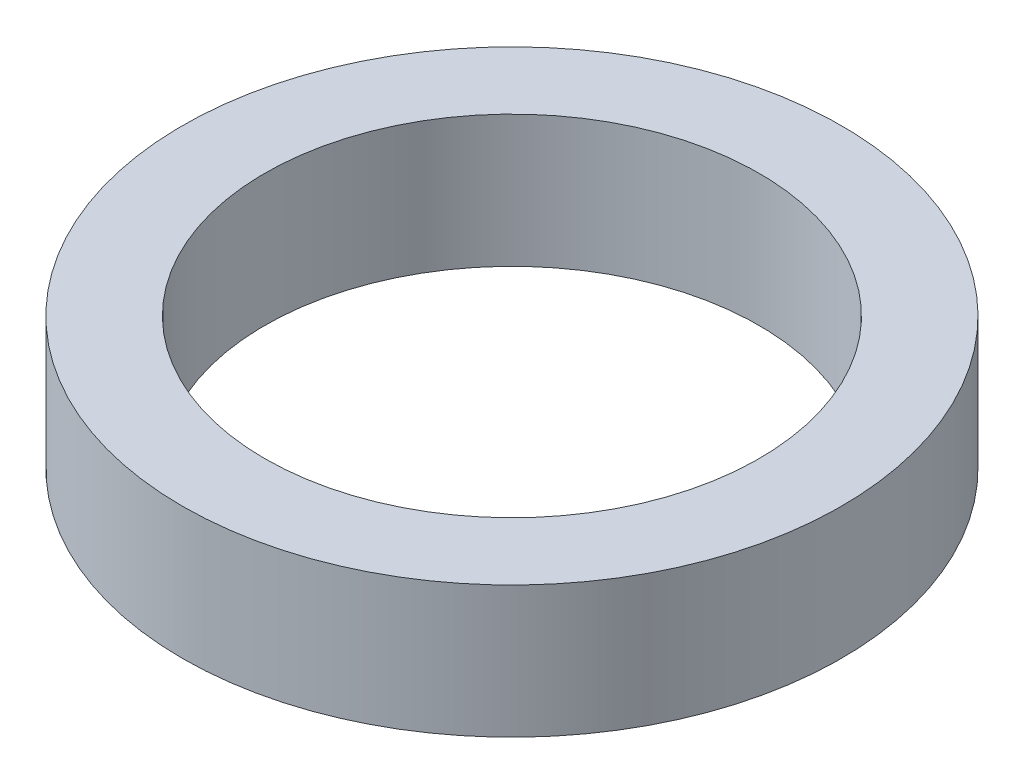
ISO-10303-21;
HEADER;
FILE_DESCRIPTION(('STEP AP214'),'2;1');
FILE_NAME('part.step','',(''),(''),'','','');
FILE_SCHEMA(('AUTOMOTIVE_DESIGN { 1 0 10303 214 1 1 1 1 }'));
ENDSEC;
DATA;
#1=APPLICATION_CONTEXT('core data for automotive mechanical design processes');
#2=APPLICATION_PROTOCOL_DEFINITION('international standard','automotive_design',2000,#1);
#3=PRODUCT_CONTEXT('',#1,'mechanical');
#4=PRODUCT('Part','Part','',(#3));
#5=PRODUCT_RELATED_PRODUCT_CATEGORY('part','',(#4));
#6=PRODUCT_DEFINITION_FORMATION('','',#4);
#7=PRODUCT_DEFINITION_CONTEXT('part definition',#1,'design');
#8=PRODUCT_DEFINITION('design','',#6,#7);
#9=PRODUCT_DEFINITION_SHAPE('','',#8);
#10=(LENGTH_UNIT() NAMED_UNIT(*) SI_UNIT(.MILLI.,.METRE.));
#11=(NAMED_UNIT(*) PLANE_ANGLE_UNIT() SI_UNIT($,.RADIAN.));
#12=(NAMED_UNIT(*) SI_UNIT($,.STERADIAN.) SOLID_ANGLE_UNIT());
#13=UNCERTAINTY_MEASURE_WITH_UNIT(LENGTH_MEASURE(1.E-05),#10,'distance_accuracy_value','');
#14=(GEOMETRIC_REPRESENTATION_CONTEXT(3) GLOBAL_UNCERTAINTY_ASSIGNED_CONTEXT((#13)) GLOBAL_UNIT_ASSIGNED_CONTEXT((#10,
#11,#12)) REPRESENTATION_CONTEXT('',''));
#15=CARTESIAN_POINT('',(0.,0.,0.));
#16=DIRECTION('',(0.,0.,1.));
#17=DIRECTION('',(1.,0.,0.));
#18=AXIS2_PLACEMENT_3D('',#15,#16,#17);
#19=CARTESIAN_POINT('',(0.,2.54,0.));
#20=DIRECTION('',(0.,1.,0.));
#21=DIRECTION('',(0.,0.,1.));
#22=AXIS2_PLACEMENT_3D('',#19,#20,#21);
#23=PLANE('',#22);
#24=CARTESIAN_POINT('',(0.,2.54,0.));
#25=DIRECTION('',(0.,1.,0.));
#26=DIRECTION('',(0.,0.,1.));
#27=AXIS2_PLACEMENT_3D('',#24,#25,#26);
#28=CIRCLE('',#27,6.35);
#29=CARTESIAN_POINT('',(0.,2.54,6.35));
#30=VERTEX_POINT('',#29);
#31=EDGE_CURVE('E10',#30,#30,#28,.T.);
#32=ORIENTED_EDGE('',*,*,#31,.T.);
#33=EDGE_LOOP('',(#32));
#34=FACE_BOUND('',#33,.T.);
#35=CARTESIAN_POINT('',(0.,2.54,0.));
#36=DIRECTION('',(0.,1.,0.));
#37=DIRECTION('',(0.,0.,1.));
#38=AXIS2_PLACEMENT_3D('',#35,#36,#37);
#39=CIRCLE('',#38,4.7625);
#40=CARTESIAN_POINT('',(0.,2.54,4.7625));
#41=VERTEX_POINT('',#40);
#42=EDGE_CURVE('E46',#41,#41,#39,.T.);
#43=ORIENTED_EDGE('',*,*,#42,.F.);
#44=EDGE_LOOP('',(#43));
#45=FACE_BOUND('',#44,.T.);
#46=ADVANCED_FACE('F35',(#34,#45),#23,.T.);
#47=CARTESIAN_POINT('',(0.,0.,0.));
#48=DIRECTION('',(0.,1.,0.));
#49=DIRECTION('',(0.,0.,1.));
#50=AXIS2_PLACEMENT_3D('',#47,#48,#49);
#51=PLANE('',#50);
#52=CARTESIAN_POINT('',(0.,0.,0.));
#53=DIRECTION('',(0.,1.,0.));
#54=DIRECTION('',(0.,0.,1.));
#55=AXIS2_PLACEMENT_3D('',#52,#53,#54);
#56=CIRCLE('',#55,6.35);
#57=CARTESIAN_POINT('',(0.,0.,6.35));
#58=VERTEX_POINT('',#57);
#59=EDGE_CURVE('E39',#58,#58,#56,.T.);
#60=ORIENTED_EDGE('',*,*,#59,.F.);
#61=EDGE_LOOP('',(#60));
#62=FACE_BOUND('',#61,.T.);
#63=CARTESIAN_POINT('',(0.,0.,0.));
#64=DIRECTION('',(0.,1.,0.));
#65=DIRECTION('',(0.,0.,1.));
#66=AXIS2_PLACEMENT_3D('',#63,#64,#65);
#67=CIRCLE('',#66,4.7625);
#68=CARTESIAN_POINT('',(0.,0.,4.7625));
#69=VERTEX_POINT('',#68);
#70=EDGE_CURVE('E48',#69,#69,#67,.T.);
#71=ORIENTED_EDGE('',*,*,#70,.T.);
#72=EDGE_LOOP('',(#71));
#73=FACE_BOUND('',#72,.T.);
#74=ADVANCED_FACE('F58',(#62,#73),#51,.F.);
#75=CARTESIAN_POINT('',(0.,2.54,0.));
#76=DIRECTION('',(0.,-1.,0.));
#77=DIRECTION('',(0.,0.,-1.));
#78=AXIS2_PLACEMENT_3D('',#75,#76,#77);
#79=CYLINDRICAL_SURFACE('',#78,6.35);
#80=ORIENTED_EDGE('',*,*,#31,.F.);
#81=EDGE_LOOP('',(#80));
#82=FACE_BOUND('',#81,.T.);
#83=ORIENTED_EDGE('',*,*,#59,.T.);
#84=EDGE_LOOP('',(#83));
#85=FACE_BOUND('',#84,.T.);
#86=ADVANCED_FACE('F37',(#82,#85),#79,.T.);
#87=CARTESIAN_POINT('',(0.,2.54,0.));
#88=DIRECTION('',(0.,-1.,0.));
#89=DIRECTION('',(0.,0.,-1.));
#90=AXIS2_PLACEMENT_3D('',#87,#88,#89);
#91=CYLINDRICAL_SURFACE('',#90,4.7625);
#92=ORIENTED_EDGE('',*,*,#42,.T.);
#93=EDGE_LOOP('',(#92));
#94=FACE_BOUND('',#93,.T.);
#95=ORIENTED_EDGE('',*,*,#70,.F.);
#96=EDGE_LOOP('',(#95));
#97=FACE_BOUND('',#96,.T.);
#98=ADVANCED_FACE('F54',(#94,#97),#91,.F.);
#99=CLOSED_SHELL('',(#46,#74,#86,#98));
#100=MANIFOLD_SOLID_BREP('B2',#99);
#101=ADVANCED_BREP_SHAPE_REPRESENTATION('',(#18,#100),#14);
#102=SHAPE_DEFINITION_REPRESENTATION(#9,#101);
ENDSEC;
END-ISO-10303-21;
